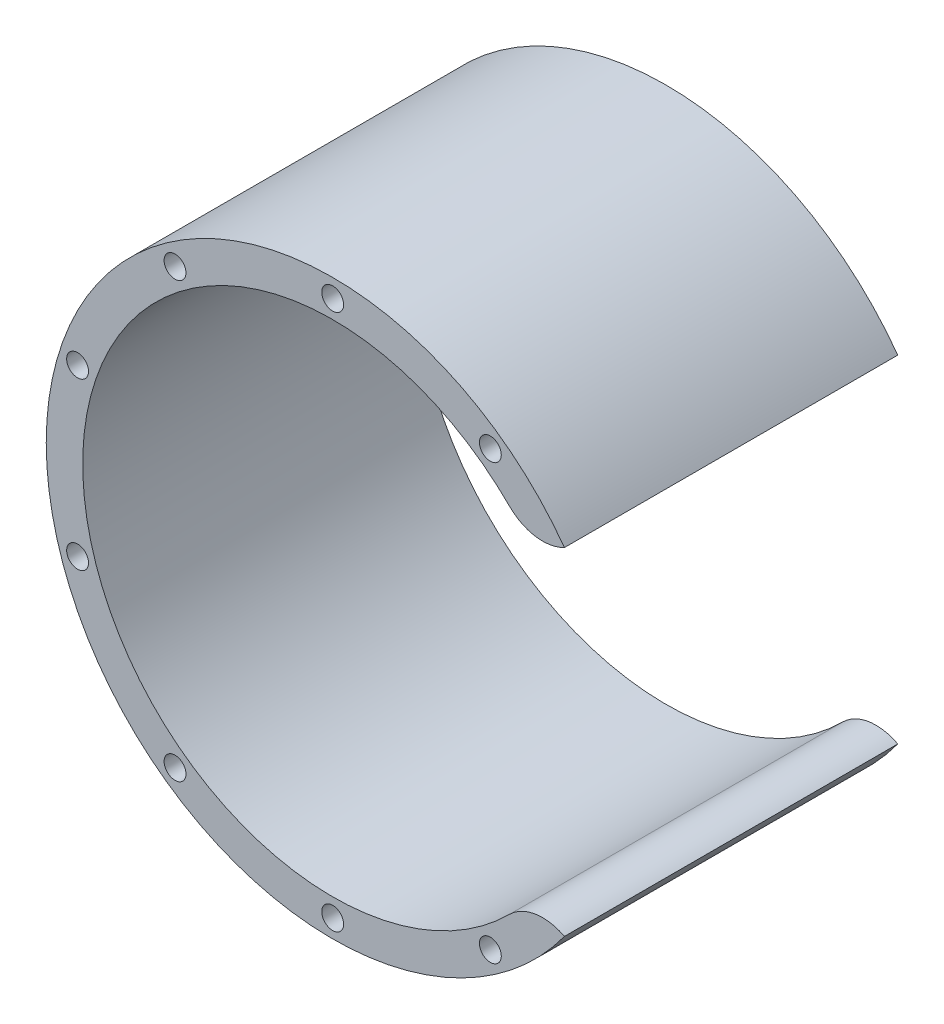
ISO-10303-21;
HEADER;
FILE_DESCRIPTION(('STEP AP214'),'2;1');
FILE_NAME('part.step','',(''),(''),'','','');
FILE_SCHEMA(('AUTOMOTIVE_DESIGN { 1 0 10303 214 1 1 1 1 }'));
ENDSEC;
DATA;
#1=APPLICATION_CONTEXT('core data for automotive mechanical design processes');
#2=APPLICATION_PROTOCOL_DEFINITION('international standard','automotive_design',2000,#1);
#3=PRODUCT_CONTEXT('',#1,'mechanical');
#4=PRODUCT('Part','Part','',(#3));
#5=PRODUCT_RELATED_PRODUCT_CATEGORY('part','',(#4));
#6=PRODUCT_DEFINITION_FORMATION('','',#4);
#7=PRODUCT_DEFINITION_CONTEXT('part definition',#1,'design');
#8=PRODUCT_DEFINITION('design','',#6,#7);
#9=PRODUCT_DEFINITION_SHAPE('','',#8);
#10=(LENGTH_UNIT() NAMED_UNIT(*) SI_UNIT(.MILLI.,.METRE.));
#11=(NAMED_UNIT(*) PLANE_ANGLE_UNIT() SI_UNIT($,.RADIAN.));
#12=(NAMED_UNIT(*) SI_UNIT($,.STERADIAN.) SOLID_ANGLE_UNIT());
#13=UNCERTAINTY_MEASURE_WITH_UNIT(LENGTH_MEASURE(1.E-05),#10,'distance_accuracy_value','');
#14=(GEOMETRIC_REPRESENTATION_CONTEXT(3) GLOBAL_UNCERTAINTY_ASSIGNED_CONTEXT((#13)) GLOBAL_UNIT_ASSIGNED_CONTEXT((#10,
#11,#12)) REPRESENTATION_CONTEXT('',''));
#15=CARTESIAN_POINT('',(0.,0.,0.));
#16=DIRECTION('',(0.,0.,1.));
#17=DIRECTION('',(1.,0.,0.));
#18=AXIS2_PLACEMENT_3D('',#15,#16,#17);
#19=CARTESIAN_POINT('',(0.,0.,64.));
#20=DIRECTION('',(0.,0.,1.));
#21=DIRECTION('',(1.,0.,0.));
#22=AXIS2_PLACEMENT_3D('',#19,#20,#21);
#23=PLANE('',#22);
#24=CARTESIAN_POINT('',(0.,0.,64.));
#25=DIRECTION('',(0.,0.,1.));
#26=DIRECTION('',(1.,0.,0.));
#27=AXIS2_PLACEMENT_3D('',#24,#25,#26);
#28=CIRCLE('',#27,55.);
#29=CARTESIAN_POINT('',(44.495934690622,32.3281888760861,64.));
#30=VERTEX_POINT('',#29);
#31=CARTESIAN_POINT('',(44.495934690622,-32.3281888760861,64.));
#32=VERTEX_POINT('',#31);
#33=EDGE_CURVE('E88',#30,#32,#28,.T.);
#34=ORIENTED_EDGE('',*,*,#33,.T.);
#35=CARTESIAN_POINT('',(40.3130669151286,-40.297104559712,64.));
#36=DIRECTION('',(0.,0.,1.));
#37=DIRECTION('',(1.,0.,0.));
#38=AXIS2_PLACEMENT_3D('',#35,#36,#37);
#39=CIRCLE('',#38,9.);
#40=CARTESIAN_POINT('',(33.9478458232662,-33.9344038397575,64.));
#41=VERTEX_POINT('',#40);
#42=EDGE_CURVE('E72',#32,#41,#39,.T.);
#43=ORIENTED_EDGE('',*,*,#42,.T.);
#44=CARTESIAN_POINT('',(0.,0.,64.));
#45=DIRECTION('',(0.,0.,1.));
#46=DIRECTION('',(1.,0.,0.));
#47=AXIS2_PLACEMENT_3D('',#44,#45,#46);
#48=CIRCLE('',#47,48.);
#49=CARTESIAN_POINT('',(33.9478458232662,33.9344038397575,64.));
#50=VERTEX_POINT('',#49);
#51=EDGE_CURVE('E98',#50,#41,#48,.T.);
#52=ORIENTED_EDGE('',*,*,#51,.F.);
#53=CARTESIAN_POINT('',(40.3130669151286,40.297104559712,64.));
#54=DIRECTION('',(0.,0.,1.));
#55=DIRECTION('',(1.,0.,0.));
#56=AXIS2_PLACEMENT_3D('',#53,#54,#55);
#57=CIRCLE('',#56,9.);
#58=EDGE_CURVE('E81',#50,#30,#57,.T.);
#59=ORIENTED_EDGE('',*,*,#58,.T.);
#60=EDGE_LOOP('',(#34,#43,#52,#59));
#61=FACE_BOUND('',#60,.T.);
#62=CARTESIAN_POINT('',(-48.9794105891964,15.9143752103042,64.));
#63=DIRECTION('',(0.,0.,1.));
#64=DIRECTION('',(1.,0.,0.));
#65=AXIS2_PLACEMENT_3D('',#62,#63,#64);
#66=CIRCLE('',#65,2.10000000000605);
#67=CARTESIAN_POINT('',(-46.8794105891903,15.9143752103042,64.));
#68=VERTEX_POINT('',#67);
#69=EDGE_CURVE('E116',#68,#68,#66,.T.);
#70=ORIENTED_EDGE('',*,*,#69,.F.);
#71=EDGE_LOOP('',(#70));
#72=FACE_BOUND('',#71,.T.);
#73=CARTESIAN_POINT('',(-30.2709404930518,-41.6643752103132,64.));
#74=DIRECTION('',(0.,0.,1.));
#75=DIRECTION('',(1.,0.,0.));
#76=AXIS2_PLACEMENT_3D('',#73,#74,#75);
#77=CIRCLE('',#76,2.10000000001154);
#78=CARTESIAN_POINT('',(-28.1709404930402,-41.6643752103132,64.));
#79=VERTEX_POINT('',#78);
#80=EDGE_CURVE('E128',#79,#79,#77,.T.);
#81=ORIENTED_EDGE('',*,*,#80,.F.);
#82=EDGE_LOOP('',(#81));
#83=FACE_BOUND('',#82,.T.);
#84=CARTESIAN_POINT('',(30.2709404930729,-41.6643752103064,64.));
#85=DIRECTION('',(0.,0.,1.));
#86=DIRECTION('',(1.,0.,0.));
#87=AXIS2_PLACEMENT_3D('',#84,#85,#86);
#88=CIRCLE('',#87,2.1000000000094);
#89=CARTESIAN_POINT('',(32.3709404930823,-41.6643752103064,64.));
#90=VERTEX_POINT('',#89);
#91=EDGE_CURVE('E140',#90,#90,#88,.T.);
#92=ORIENTED_EDGE('',*,*,#91,.F.);
#93=EDGE_LOOP('',(#92));
#94=FACE_BOUND('',#93,.T.);
#95=CARTESIAN_POINT('',(0.,51.5,64.));
#96=DIRECTION('',(0.,0.,1.));
#97=DIRECTION('',(1.,0.,0.));
#98=AXIS2_PLACEMENT_3D('',#95,#96,#97);
#99=CIRCLE('',#98,2.1);
#100=CARTESIAN_POINT('',(2.1,51.5,64.));
#101=VERTEX_POINT('',#100);
#102=EDGE_CURVE('E152',#101,#101,#99,.T.);
#103=ORIENTED_EDGE('',*,*,#102,.F.);
#104=EDGE_LOOP('',(#103));
#105=FACE_BOUND('',#104,.T.);
#106=CARTESIAN_POINT('',(30.2709404930635,41.6643752103132,64.));
#107=DIRECTION('',(0.,0.,1.));
#108=DIRECTION('',(1.,0.,0.));
#109=AXIS2_PLACEMENT_3D('',#106,#107,#108);
#110=CIRCLE('',#109,2.10000000000013);
#111=CARTESIAN_POINT('',(32.3709404930636,41.6643752103132,64.));
#112=VERTEX_POINT('',#111);
#113=EDGE_CURVE('E146',#112,#112,#110,.T.);
#114=ORIENTED_EDGE('',*,*,#113,.F.);
#115=EDGE_LOOP('',(#114));
#116=FACE_BOUND('',#115,.T.);
#117=CARTESIAN_POINT('',(1.16971304232952E-11,-51.5,64.));
#118=DIRECTION('',(0.,0.,1.));
#119=DIRECTION('',(1.,0.,0.));
#120=AXIS2_PLACEMENT_3D('',#117,#118,#119);
#121=CIRCLE('',#120,2.10000000001153);
#122=CARTESIAN_POINT('',(2.10000000002323,-51.5,64.));
#123=VERTEX_POINT('',#122);
#124=EDGE_CURVE('E134',#123,#123,#121,.T.);
#125=ORIENTED_EDGE('',*,*,#124,.F.);
#126=EDGE_LOOP('',(#125));
#127=FACE_BOUND('',#126,.T.);
#128=CARTESIAN_POINT('',(-48.9794105891928,-15.9143752103154,64.));
#129=DIRECTION('',(0.,0.,1.));
#130=DIRECTION('',(1.,0.,0.));
#131=AXIS2_PLACEMENT_3D('',#128,#129,#130);
#132=CIRCLE('',#131,2.10000000000943);
#133=CARTESIAN_POINT('',(-46.8794105891833,-15.9143752103154,64.));
#134=VERTEX_POINT('',#133);
#135=EDGE_CURVE('E122',#134,#134,#132,.T.);
#136=ORIENTED_EDGE('',*,*,#135,.F.);
#137=EDGE_LOOP('',(#136));
#138=FACE_BOUND('',#137,.T.);
#139=CARTESIAN_POINT('',(-30.2709404930613,41.6643752103064,64.));
#140=DIRECTION('',(0.,0.,1.));
#141=DIRECTION('',(1.,0.,0.));
#142=AXIS2_PLACEMENT_3D('',#139,#140,#141);
#143=CIRCLE('',#142,2.10000000000272);
#144=CARTESIAN_POINT('',(-28.1709404930585,41.6643752103064,64.));
#145=VERTEX_POINT('',#144);
#146=EDGE_CURVE('E110',#145,#145,#143,.T.);
#147=ORIENTED_EDGE('',*,*,#146,.F.);
#148=EDGE_LOOP('',(#147));
#149=FACE_BOUND('',#148,.T.);
#150=ADVANCED_FACE('F33',(#61,#72,#83,#94,#105,#116,#127,#138,#149),#23,.T.);
#151=CARTESIAN_POINT('',(0.,0.,0.));
#152=DIRECTION('',(0.,0.,1.));
#153=DIRECTION('',(1.,0.,0.));
#154=AXIS2_PLACEMENT_3D('',#151,#152,#153);
#155=PLANE('',#154);
#156=CARTESIAN_POINT('',(0.,0.,0.));
#157=DIRECTION('',(0.,0.,1.));
#158=DIRECTION('',(1.,0.,0.));
#159=AXIS2_PLACEMENT_3D('',#156,#157,#158);
#160=CIRCLE('',#159,48.);
#161=CARTESIAN_POINT('',(33.9478458232662,33.9344038397575,0.));
#162=VERTEX_POINT('',#161);
#163=CARTESIAN_POINT('',(33.9478458232662,-33.9344038397575,0.));
#164=VERTEX_POINT('',#163);
#165=EDGE_CURVE('E101',#162,#164,#160,.T.);
#166=ORIENTED_EDGE('',*,*,#165,.T.);
#167=CARTESIAN_POINT('',(40.3130669151286,-40.297104559712,0.));
#168=DIRECTION('',(0.,0.,1.));
#169=DIRECTION('',(1.,0.,0.));
#170=AXIS2_PLACEMENT_3D('',#167,#168,#169);
#171=CIRCLE('',#170,9.);
#172=CARTESIAN_POINT('',(44.495934690622,-32.3281888760861,0.));
#173=VERTEX_POINT('',#172);
#174=EDGE_CURVE('E11',#164,#173,#171,.F.);
#175=ORIENTED_EDGE('',*,*,#174,.T.);
#176=CARTESIAN_POINT('',(0.,0.,0.));
#177=DIRECTION('',(0.,0.,1.));
#178=DIRECTION('',(1.,0.,0.));
#179=AXIS2_PLACEMENT_3D('',#176,#177,#178);
#180=CIRCLE('',#179,55.);
#181=CARTESIAN_POINT('',(44.495934690622,32.3281888760861,0.));
#182=VERTEX_POINT('',#181);
#183=EDGE_CURVE('E90',#182,#173,#180,.T.);
#184=ORIENTED_EDGE('',*,*,#183,.F.);
#185=CARTESIAN_POINT('',(40.3130669151286,40.297104559712,0.));
#186=DIRECTION('',(0.,0.,1.));
#187=DIRECTION('',(1.,0.,0.));
#188=AXIS2_PLACEMENT_3D('',#185,#186,#187);
#189=CIRCLE('',#188,9.);
#190=EDGE_CURVE('E41',#182,#162,#189,.F.);
#191=ORIENTED_EDGE('',*,*,#190,.T.);
#192=EDGE_LOOP('',(#166,#175,#184,#191));
#193=FACE_BOUND('',#192,.T.);
#194=CARTESIAN_POINT('',(0.,51.5,0.));
#195=DIRECTION('',(0.,0.,1.));
#196=DIRECTION('',(1.,0.,0.));
#197=AXIS2_PLACEMENT_3D('',#194,#195,#196);
#198=CIRCLE('',#197,2.1);
#199=CARTESIAN_POINT('',(2.1,51.5,0.));
#200=VERTEX_POINT('',#199);
#201=EDGE_CURVE('E149',#200,#200,#198,.T.);
#202=ORIENTED_EDGE('',*,*,#201,.T.);
#203=EDGE_LOOP('',(#202));
#204=FACE_BOUND('',#203,.T.);
#205=CARTESIAN_POINT('',(30.2709404930635,41.6643752103132,0.));
#206=DIRECTION('',(0.,0.,1.));
#207=DIRECTION('',(1.,0.,0.));
#208=AXIS2_PLACEMENT_3D('',#205,#206,#207);
#209=CIRCLE('',#208,2.10000000000013);
#210=CARTESIAN_POINT('',(32.3709404930636,41.6643752103132,0.));
#211=VERTEX_POINT('',#210);
#212=EDGE_CURVE('E143',#211,#211,#209,.T.);
#213=ORIENTED_EDGE('',*,*,#212,.T.);
#214=EDGE_LOOP('',(#213));
#215=FACE_BOUND('',#214,.T.);
#216=CARTESIAN_POINT('',(30.2709404930729,-41.6643752103064,0.));
#217=DIRECTION('',(0.,0.,1.));
#218=DIRECTION('',(1.,0.,0.));
#219=AXIS2_PLACEMENT_3D('',#216,#217,#218);
#220=CIRCLE('',#219,2.1000000000094);
#221=CARTESIAN_POINT('',(32.3709404930823,-41.6643752103064,0.));
#222=VERTEX_POINT('',#221);
#223=EDGE_CURVE('E137',#222,#222,#220,.T.);
#224=ORIENTED_EDGE('',*,*,#223,.T.);
#225=EDGE_LOOP('',(#224));
#226=FACE_BOUND('',#225,.T.);
#227=CARTESIAN_POINT('',(1.16971304232952E-11,-51.5,0.));
#228=DIRECTION('',(0.,0.,1.));
#229=DIRECTION('',(1.,0.,0.));
#230=AXIS2_PLACEMENT_3D('',#227,#228,#229);
#231=CIRCLE('',#230,2.10000000001153);
#232=CARTESIAN_POINT('',(2.10000000002323,-51.5,0.));
#233=VERTEX_POINT('',#232);
#234=EDGE_CURVE('E131',#233,#233,#231,.T.);
#235=ORIENTED_EDGE('',*,*,#234,.T.);
#236=EDGE_LOOP('',(#235));
#237=FACE_BOUND('',#236,.T.);
#238=CARTESIAN_POINT('',(-30.2709404930518,-41.6643752103132,0.));
#239=DIRECTION('',(0.,0.,1.));
#240=DIRECTION('',(1.,0.,0.));
#241=AXIS2_PLACEMENT_3D('',#238,#239,#240);
#242=CIRCLE('',#241,2.10000000001154);
#243=CARTESIAN_POINT('',(-28.1709404930402,-41.6643752103132,0.));
#244=VERTEX_POINT('',#243);
#245=EDGE_CURVE('E125',#244,#244,#242,.T.);
#246=ORIENTED_EDGE('',*,*,#245,.T.);
#247=EDGE_LOOP('',(#246));
#248=FACE_BOUND('',#247,.T.);
#249=CARTESIAN_POINT('',(-48.9794105891928,-15.9143752103154,0.));
#250=DIRECTION('',(0.,0.,1.));
#251=DIRECTION('',(1.,0.,0.));
#252=AXIS2_PLACEMENT_3D('',#249,#250,#251);
#253=CIRCLE('',#252,2.10000000000943);
#254=CARTESIAN_POINT('',(-46.8794105891833,-15.9143752103154,0.));
#255=VERTEX_POINT('',#254);
#256=EDGE_CURVE('E119',#255,#255,#253,.T.);
#257=ORIENTED_EDGE('',*,*,#256,.T.);
#258=EDGE_LOOP('',(#257));
#259=FACE_BOUND('',#258,.T.);
#260=CARTESIAN_POINT('',(-48.9794105891964,15.9143752103042,0.));
#261=DIRECTION('',(0.,0.,1.));
#262=DIRECTION('',(1.,0.,0.));
#263=AXIS2_PLACEMENT_3D('',#260,#261,#262);
#264=CIRCLE('',#263,2.10000000000605);
#265=CARTESIAN_POINT('',(-46.8794105891903,15.9143752103042,0.));
#266=VERTEX_POINT('',#265);
#267=EDGE_CURVE('E113',#266,#266,#264,.T.);
#268=ORIENTED_EDGE('',*,*,#267,.T.);
#269=EDGE_LOOP('',(#268));
#270=FACE_BOUND('',#269,.T.);
#271=CARTESIAN_POINT('',(-30.2709404930613,41.6643752103064,0.));
#272=DIRECTION('',(0.,0.,1.));
#273=DIRECTION('',(1.,0.,0.));
#274=AXIS2_PLACEMENT_3D('',#271,#272,#273);
#275=CIRCLE('',#274,2.10000000000272);
#276=CARTESIAN_POINT('',(-28.1709404930585,41.6643752103064,0.));
#277=VERTEX_POINT('',#276);
#278=EDGE_CURVE('E91',#277,#277,#275,.T.);
#279=ORIENTED_EDGE('',*,*,#278,.T.);
#280=EDGE_LOOP('',(#279));
#281=FACE_BOUND('',#280,.T.);
#282=ADVANCED_FACE('F158',(#193,#204,#215,#226,#237,#248,#259,#270,#281),#155,.F.);
#283=CARTESIAN_POINT('',(0.,0.,64.));
#284=DIRECTION('',(0.,0.,-1.));
#285=DIRECTION('',(-1.,0.,0.));
#286=AXIS2_PLACEMENT_3D('',#283,#284,#285);
#287=CYLINDRICAL_SURFACE('',#286,55.);
#288=ORIENTED_EDGE('',*,*,#183,.T.);
#289=DIRECTION('',(0.,0.,-1.));
#290=VECTOR('',#289,1.);
#291=CARTESIAN_POINT('',(44.495934690622,-32.3281888760861,64.));
#292=LINE('',#291,#290);
#293=EDGE_CURVE('E76',#173,#32,#292,.F.);
#294=ORIENTED_EDGE('',*,*,#293,.T.);
#295=ORIENTED_EDGE('',*,*,#33,.F.);
#296=DIRECTION('',(0.,0.,-1.));
#297=VECTOR('',#296,1.);
#298=CARTESIAN_POINT('',(44.495934690622,32.3281888760861,64.));
#299=LINE('',#298,#297);
#300=EDGE_CURVE('E92',#30,#182,#299,.T.);
#301=ORIENTED_EDGE('',*,*,#300,.T.);
#302=EDGE_LOOP('',(#288,#294,#295,#301));
#303=FACE_BOUND('',#302,.T.);
#304=ADVANCED_FACE('F86',(#303),#287,.T.);
#305=CARTESIAN_POINT('',(0.,0.,64.));
#306=DIRECTION('',(0.,0.,-1.));
#307=DIRECTION('',(-1.,0.,0.));
#308=AXIS2_PLACEMENT_3D('',#305,#306,#307);
#309=CYLINDRICAL_SURFACE('',#308,48.);
#310=ORIENTED_EDGE('',*,*,#51,.T.);
#311=DIRECTION('',(0.,0.,-1.));
#312=VECTOR('',#311,1.);
#313=CARTESIAN_POINT('',(33.9478458232662,-33.9344038397575,64.));
#314=LINE('',#313,#312);
#315=EDGE_CURVE('E48',#41,#164,#314,.T.);
#316=ORIENTED_EDGE('',*,*,#315,.T.);
#317=ORIENTED_EDGE('',*,*,#165,.F.);
#318=DIRECTION('',(0.,0.,-1.));
#319=VECTOR('',#318,1.);
#320=CARTESIAN_POINT('',(33.9478458232662,33.9344038397575,64.));
#321=LINE('',#320,#319);
#322=EDGE_CURVE('E80',#162,#50,#321,.F.);
#323=ORIENTED_EDGE('',*,*,#322,.T.);
#324=EDGE_LOOP('',(#310,#316,#317,#323));
#325=FACE_BOUND('',#324,.T.);
#326=ADVANCED_FACE('F106',(#325),#309,.F.);
#327=CARTESIAN_POINT('',(0.,51.5,64.));
#328=DIRECTION('',(0.,0.,-1.));
#329=DIRECTION('',(-1.,0.,0.));
#330=AXIS2_PLACEMENT_3D('',#327,#328,#329);
#331=CYLINDRICAL_SURFACE('',#330,2.1);
#332=ORIENTED_EDGE('',*,*,#102,.T.);
#333=EDGE_LOOP('',(#332));
#334=FACE_BOUND('',#333,.T.);
#335=ORIENTED_EDGE('',*,*,#201,.F.);
#336=EDGE_LOOP('',(#335));
#337=FACE_BOUND('',#336,.T.);
#338=ADVANCED_FACE('F161',(#334,#337),#331,.F.);
#339=CARTESIAN_POINT('',(30.2709404930635,41.6643752103132,64.));
#340=DIRECTION('',(0.,0.,-1.));
#341=DIRECTION('',(-1.,0.,0.));
#342=AXIS2_PLACEMENT_3D('',#339,#340,#341);
#343=CYLINDRICAL_SURFACE('',#342,2.10000000000013);
#344=ORIENTED_EDGE('',*,*,#113,.T.);
#345=EDGE_LOOP('',(#344));
#346=FACE_BOUND('',#345,.T.);
#347=ORIENTED_EDGE('',*,*,#212,.F.);
#348=EDGE_LOOP('',(#347));
#349=FACE_BOUND('',#348,.T.);
#350=ADVANCED_FACE('F163',(#346,#349),#343,.F.);
#351=CARTESIAN_POINT('',(30.2709404930729,-41.6643752103064,64.));
#352=DIRECTION('',(0.,0.,-1.));
#353=DIRECTION('',(-1.,0.,0.));
#354=AXIS2_PLACEMENT_3D('',#351,#352,#353);
#355=CYLINDRICAL_SURFACE('',#354,2.1000000000094);
#356=ORIENTED_EDGE('',*,*,#91,.T.);
#357=EDGE_LOOP('',(#356));
#358=FACE_BOUND('',#357,.T.);
#359=ORIENTED_EDGE('',*,*,#223,.F.);
#360=EDGE_LOOP('',(#359));
#361=FACE_BOUND('',#360,.T.);
#362=ADVANCED_FACE('F170',(#358,#361),#355,.F.);
#363=CARTESIAN_POINT('',(1.16971304232952E-11,-51.5,64.));
#364=DIRECTION('',(0.,0.,-1.));
#365=DIRECTION('',(-1.,0.,0.));
#366=AXIS2_PLACEMENT_3D('',#363,#364,#365);
#367=CYLINDRICAL_SURFACE('',#366,2.10000000001153);
#368=ORIENTED_EDGE('',*,*,#124,.T.);
#369=EDGE_LOOP('',(#368));
#370=FACE_BOUND('',#369,.T.);
#371=ORIENTED_EDGE('',*,*,#234,.F.);
#372=EDGE_LOOP('',(#371));
#373=FACE_BOUND('',#372,.T.);
#374=ADVANCED_FACE('F206',(#370,#373),#367,.F.);
#375=CARTESIAN_POINT('',(-30.2709404930518,-41.6643752103132,64.));
#376=DIRECTION('',(0.,0.,-1.));
#377=DIRECTION('',(-1.,0.,0.));
#378=AXIS2_PLACEMENT_3D('',#375,#376,#377);
#379=CYLINDRICAL_SURFACE('',#378,2.10000000001154);
#380=ORIENTED_EDGE('',*,*,#80,.T.);
#381=EDGE_LOOP('',(#380));
#382=FACE_BOUND('',#381,.T.);
#383=ORIENTED_EDGE('',*,*,#245,.F.);
#384=EDGE_LOOP('',(#383));
#385=FACE_BOUND('',#384,.T.);
#386=ADVANCED_FACE('F202',(#382,#385),#379,.F.);
#387=CARTESIAN_POINT('',(-48.9794105891928,-15.9143752103154,64.));
#388=DIRECTION('',(0.,0.,-1.));
#389=DIRECTION('',(-1.,0.,0.));
#390=AXIS2_PLACEMENT_3D('',#387,#388,#389);
#391=CYLINDRICAL_SURFACE('',#390,2.10000000000943);
#392=ORIENTED_EDGE('',*,*,#135,.T.);
#393=EDGE_LOOP('',(#392));
#394=FACE_BOUND('',#393,.T.);
#395=ORIENTED_EDGE('',*,*,#256,.F.);
#396=EDGE_LOOP('',(#395));
#397=FACE_BOUND('',#396,.T.);
#398=ADVANCED_FACE('F195',(#394,#397),#391,.F.);
#399=CARTESIAN_POINT('',(-48.9794105891964,15.9143752103042,64.));
#400=DIRECTION('',(0.,0.,-1.));
#401=DIRECTION('',(-1.,0.,0.));
#402=AXIS2_PLACEMENT_3D('',#399,#400,#401);
#403=CYLINDRICAL_SURFACE('',#402,2.10000000000605);
#404=ORIENTED_EDGE('',*,*,#69,.T.);
#405=EDGE_LOOP('',(#404));
#406=FACE_BOUND('',#405,.T.);
#407=ORIENTED_EDGE('',*,*,#267,.F.);
#408=EDGE_LOOP('',(#407));
#409=FACE_BOUND('',#408,.T.);
#410=ADVANCED_FACE('F190',(#406,#409),#403,.F.);
#411=CARTESIAN_POINT('',(-30.2709404930613,41.6643752103064,64.));
#412=DIRECTION('',(0.,0.,-1.));
#413=DIRECTION('',(-1.,0.,0.));
#414=AXIS2_PLACEMENT_3D('',#411,#412,#413);
#415=CYLINDRICAL_SURFACE('',#414,2.10000000000272);
#416=ORIENTED_EDGE('',*,*,#146,.T.);
#417=EDGE_LOOP('',(#416));
#418=FACE_BOUND('',#417,.T.);
#419=ORIENTED_EDGE('',*,*,#278,.F.);
#420=EDGE_LOOP('',(#419));
#421=FACE_BOUND('',#420,.T.);
#422=ADVANCED_FACE('F185',(#418,#421),#415,.F.);
#423=CARTESIAN_POINT('',(40.3130669151286,-40.297104559712,64.));
#424=DIRECTION('',(0.,0.,1.));
#425=DIRECTION('',(1.,0.,0.));
#426=AXIS2_PLACEMENT_3D('',#423,#424,#425);
#427=CYLINDRICAL_SURFACE('',#426,9.);
#428=ORIENTED_EDGE('',*,*,#174,.F.);
#429=ORIENTED_EDGE('',*,*,#315,.F.);
#430=ORIENTED_EDGE('',*,*,#42,.F.);
#431=ORIENTED_EDGE('',*,*,#293,.F.);
#432=EDGE_LOOP('',(#428,#429,#430,#431));
#433=FACE_BOUND('',#432,.T.);
#434=ADVANCED_FACE('F75',(#433),#427,.T.);
#435=CARTESIAN_POINT('',(40.3130669151286,40.297104559712,64.));
#436=DIRECTION('',(0.,0.,-1.));
#437=DIRECTION('',(-1.,0.,0.));
#438=AXIS2_PLACEMENT_3D('',#435,#436,#437);
#439=CYLINDRICAL_SURFACE('',#438,9.);
#440=ORIENTED_EDGE('',*,*,#58,.F.);
#441=ORIENTED_EDGE('',*,*,#322,.F.);
#442=ORIENTED_EDGE('',*,*,#190,.F.);
#443=ORIENTED_EDGE('',*,*,#300,.F.);
#444=EDGE_LOOP('',(#440,#441,#442,#443));
#445=FACE_BOUND('',#444,.T.);
#446=ADVANCED_FACE('F35',(#445),#439,.T.);
#447=CLOSED_SHELL('',(#150,#282,#304,#326,#338,#350,#362,#374,#386,#398,#410,#422,#434,#446));
#448=MANIFOLD_SOLID_BREP('B2',#447);
#449=ADVANCED_BREP_SHAPE_REPRESENTATION('',(#18,#448),#14);
#450=SHAPE_DEFINITION_REPRESENTATION(#9,#449);
ENDSEC;
END-ISO-10303-21;
